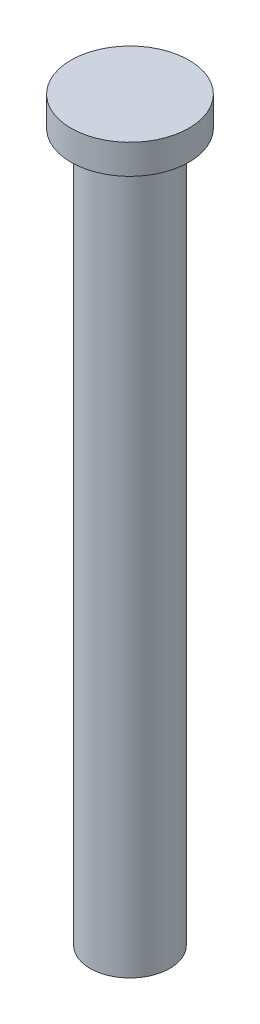
ISO-10303-21;
HEADER;
FILE_DESCRIPTION(('STEP AP214'),'2;1');
FILE_NAME('part.step','',(''),(''),'','','');
FILE_SCHEMA(('AUTOMOTIVE_DESIGN { 1 0 10303 214 1 1 1 1 }'));
ENDSEC;
DATA;
#1=APPLICATION_CONTEXT('core data for automotive mechanical design processes');
#2=APPLICATION_PROTOCOL_DEFINITION('international standard','automotive_design',2000,#1);
#3=PRODUCT_CONTEXT('',#1,'mechanical');
#4=PRODUCT('Part','Part','',(#3));
#5=PRODUCT_RELATED_PRODUCT_CATEGORY('part','',(#4));
#6=PRODUCT_DEFINITION_FORMATION('','',#4);
#7=PRODUCT_DEFINITION_CONTEXT('part definition',#1,'design');
#8=PRODUCT_DEFINITION('design','',#6,#7);
#9=PRODUCT_DEFINITION_SHAPE('','',#8);
#10=(LENGTH_UNIT() NAMED_UNIT(*) SI_UNIT(.MILLI.,.METRE.));
#11=(NAMED_UNIT(*) PLANE_ANGLE_UNIT() SI_UNIT($,.RADIAN.));
#12=(NAMED_UNIT(*) SI_UNIT($,.STERADIAN.) SOLID_ANGLE_UNIT());
#13=UNCERTAINTY_MEASURE_WITH_UNIT(LENGTH_MEASURE(1.E-05),#10,'distance_accuracy_value','');
#14=(GEOMETRIC_REPRESENTATION_CONTEXT(3) GLOBAL_UNCERTAINTY_ASSIGNED_CONTEXT((#13)) GLOBAL_UNIT_ASSIGNED_CONTEXT((#10,
#11,#12)) REPRESENTATION_CONTEXT('',''));
#15=CARTESIAN_POINT('',(0.,0.,0.));
#16=DIRECTION('',(0.,0.,1.));
#17=DIRECTION('',(1.,0.,0.));
#18=AXIS2_PLACEMENT_3D('',#15,#16,#17);
#19=CARTESIAN_POINT('',(0.,120.,0.));
#20=DIRECTION('',(0.,-1.,0.));
#21=DIRECTION('',(0.,0.,-1.));
#22=AXIS2_PLACEMENT_3D('',#19,#20,#21);
#23=CYLINDRICAL_SURFACE('',#22,6.75);
#24=CARTESIAN_POINT('',(0.,120.,0.));
#25=DIRECTION('',(0.,1.,0.));
#26=DIRECTION('',(0.,0.,1.));
#27=AXIS2_PLACEMENT_3D('',#24,#25,#26);
#28=CIRCLE('',#27,6.75);
#29=CARTESIAN_POINT('',(0.,120.,6.75));
#30=VERTEX_POINT('',#29);
#31=EDGE_CURVE('E10',#30,#30,#28,.T.);
#32=ORIENTED_EDGE('',*,*,#31,.F.);
#33=EDGE_LOOP('',(#32));
#34=FACE_BOUND('',#33,.T.);
#35=CARTESIAN_POINT('',(0.,0.,0.));
#36=DIRECTION('',(0.,1.,0.));
#37=DIRECTION('',(0.,0.,1.));
#38=AXIS2_PLACEMENT_3D('',#35,#36,#37);
#39=CIRCLE('',#38,6.75);
#40=CARTESIAN_POINT('',(0.,0.,6.75));
#41=VERTEX_POINT('',#40);
#42=EDGE_CURVE('E40',#41,#41,#39,.T.);
#43=ORIENTED_EDGE('',*,*,#42,.T.);
#44=EDGE_LOOP('',(#43));
#45=FACE_BOUND('',#44,.T.);
#46=ADVANCED_FACE('F37',(#34,#45),#23,.T.);
#47=CARTESIAN_POINT('',(0.,0.,0.));
#48=DIRECTION('',(0.,1.,0.));
#49=DIRECTION('',(0.,0.,1.));
#50=AXIS2_PLACEMENT_3D('',#47,#48,#49);
#51=PLANE('',#50);
#52=ORIENTED_EDGE('',*,*,#42,.F.);
#53=EDGE_LOOP('',(#52));
#54=FACE_BOUND('',#53,.T.);
#55=ADVANCED_FACE('F64',(#54),#51,.F.);
#56=CARTESIAN_POINT('',(0.,125.,0.));
#57=DIRECTION('',(0.,-1.,0.));
#58=DIRECTION('',(0.,0.,-1.));
#59=AXIS2_PLACEMENT_3D('',#56,#57,#58);
#60=CYLINDRICAL_SURFACE('',#59,10.);
#61=CARTESIAN_POINT('',(0.,125.,0.));
#62=DIRECTION('',(0.,1.,0.));
#63=DIRECTION('',(0.,0.,1.));
#64=AXIS2_PLACEMENT_3D('',#61,#62,#63);
#65=CIRCLE('',#64,10.);
#66=CARTESIAN_POINT('',(0.,125.,10.));
#67=VERTEX_POINT('',#66);
#68=EDGE_CURVE('E49',#67,#67,#65,.T.);
#69=ORIENTED_EDGE('',*,*,#68,.F.);
#70=EDGE_LOOP('',(#69));
#71=FACE_BOUND('',#70,.T.);
#72=CARTESIAN_POINT('',(0.,120.,0.));
#73=DIRECTION('',(0.,1.,0.));
#74=DIRECTION('',(0.,0.,1.));
#75=AXIS2_PLACEMENT_3D('',#72,#73,#74);
#76=CIRCLE('',#75,10.);
#77=CARTESIAN_POINT('',(0.,120.,10.));
#78=VERTEX_POINT('',#77);
#79=EDGE_CURVE('E51',#78,#78,#76,.T.);
#80=ORIENTED_EDGE('',*,*,#79,.T.);
#81=EDGE_LOOP('',(#80));
#82=FACE_BOUND('',#81,.T.);
#83=ADVANCED_FACE('F61',(#71,#82),#60,.T.);
#84=CARTESIAN_POINT('',(0.,125.,0.));
#85=DIRECTION('',(0.,1.,0.));
#86=DIRECTION('',(0.,0.,1.));
#87=AXIS2_PLACEMENT_3D('',#84,#85,#86);
#88=PLANE('',#87);
#89=ORIENTED_EDGE('',*,*,#68,.T.);
#90=EDGE_LOOP('',(#89));
#91=FACE_BOUND('',#90,.T.);
#92=ADVANCED_FACE('F59',(#91),#88,.T.);
#93=CARTESIAN_POINT('',(0.,120.,0.));
#94=DIRECTION('',(0.,1.,0.));
#95=DIRECTION('',(0.,0.,1.));
#96=AXIS2_PLACEMENT_3D('',#93,#94,#95);
#97=PLANE('',#96);
#98=ORIENTED_EDGE('',*,*,#31,.T.);
#99=EDGE_LOOP('',(#98));
#100=FACE_BOUND('',#99,.T.);
#101=ORIENTED_EDGE('',*,*,#79,.F.);
#102=EDGE_LOOP('',(#101));
#103=FACE_BOUND('',#102,.T.);
#104=ADVANCED_FACE('F68',(#100,#103),#97,.F.);
#105=CLOSED_SHELL('',(#46,#55,#83,#92,#104));
#106=MANIFOLD_SOLID_BREP('B2',#105);
#107=ADVANCED_BREP_SHAPE_REPRESENTATION('',(#18,#106),#14);
#108=SHAPE_DEFINITION_REPRESENTATION(#9,#107);
ENDSEC;
END-ISO-10303-21;
